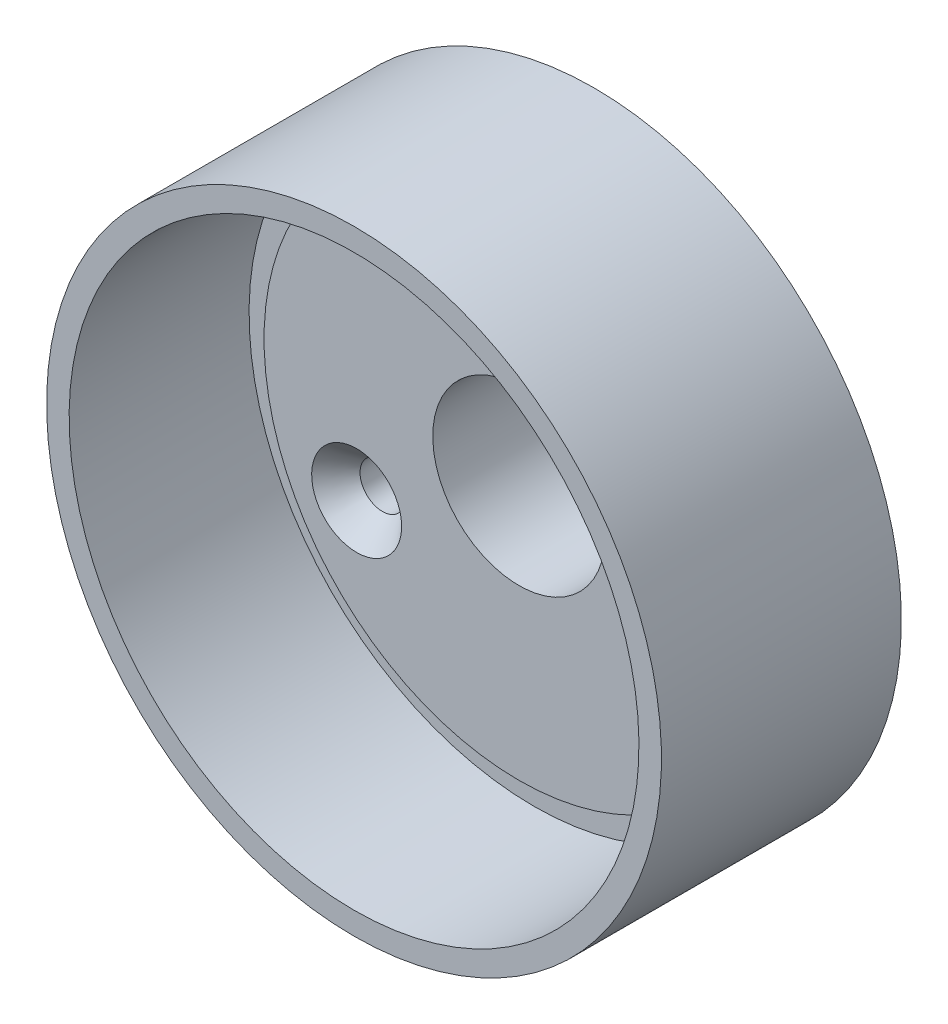
ISO-10303-21;
HEADER;
FILE_DESCRIPTION(('STEP AP214'),'2;1');
FILE_NAME('part.step','',(''),(''),'','','');
FILE_SCHEMA(('AUTOMOTIVE_DESIGN { 1 0 10303 214 1 1 1 1 }'));
ENDSEC;
DATA;
#1=APPLICATION_CONTEXT('core data for automotive mechanical design processes');
#2=APPLICATION_PROTOCOL_DEFINITION('international standard','automotive_design',2000,#1);
#3=PRODUCT_CONTEXT('',#1,'mechanical');
#4=PRODUCT('Part','Part','',(#3));
#5=PRODUCT_RELATED_PRODUCT_CATEGORY('part','',(#4));
#6=PRODUCT_DEFINITION_FORMATION('','',#4);
#7=PRODUCT_DEFINITION_CONTEXT('part definition',#1,'design');
#8=PRODUCT_DEFINITION('design','',#6,#7);
#9=PRODUCT_DEFINITION_SHAPE('','',#8);
#10=(LENGTH_UNIT() NAMED_UNIT(*) SI_UNIT(.MILLI.,.METRE.));
#11=(NAMED_UNIT(*) PLANE_ANGLE_UNIT() SI_UNIT($,.RADIAN.));
#12=(NAMED_UNIT(*) SI_UNIT($,.STERADIAN.) SOLID_ANGLE_UNIT());
#13=UNCERTAINTY_MEASURE_WITH_UNIT(LENGTH_MEASURE(1.E-05),#10,'distance_accuracy_value','');
#14=(GEOMETRIC_REPRESENTATION_CONTEXT(3) GLOBAL_UNCERTAINTY_ASSIGNED_CONTEXT((#13)) GLOBAL_UNIT_ASSIGNED_CONTEXT((#10,
#11,#12)) REPRESENTATION_CONTEXT('',''));
#15=CARTESIAN_POINT('',(0.,0.,0.));
#16=DIRECTION('',(0.,0.,1.));
#17=DIRECTION('',(1.,0.,0.));
#18=AXIS2_PLACEMENT_3D('',#15,#16,#17);
#19=CARTESIAN_POINT('',(0.,53.975,41.275));
#20=DIRECTION('',(0.,0.,-1.));
#21=DIRECTION('',(0.,1.,0.));
#22=AXIS2_PLACEMENT_3D('',#19,#20,#21);
#23=PLANE('',#22);
#24=CARTESIAN_POINT('',(0.,39.6875,41.275));
#25=DIRECTION('',(0.,0.,1.));
#26=DIRECTION('',(1.,0.,0.));
#27=AXIS2_PLACEMENT_3D('',#24,#25,#26);
#28=CIRCLE('',#27,9.525);
#29=CARTESIAN_POINT('',(9.525,39.6875,41.275));
#30=VERTEX_POINT('',#29);
#31=EDGE_CURVE('E80',#30,#30,#28,.T.);
#32=ORIENTED_EDGE('',*,*,#31,.F.);
#33=EDGE_LOOP('',(#32));
#34=FACE_BOUND('',#33,.T.);
#35=CARTESIAN_POINT('',(0.,0.,41.275));
#36=DIRECTION('',(0.,0.,-1.));
#37=DIRECTION('',(0.,1.,0.));
#38=AXIS2_PLACEMENT_3D('',#35,#36,#37);
#39=CIRCLE('',#38,18.25625);
#40=CARTESIAN_POINT('',(0.,18.25625,41.275));
#41=VERTEX_POINT('',#40);
#42=EDGE_CURVE('E88',#41,#41,#39,.T.);
#43=ORIENTED_EDGE('',*,*,#42,.T.);
#44=EDGE_LOOP('',(#43));
#45=FACE_BOUND('',#44,.T.);
#46=CARTESIAN_POINT('',(0.,0.,41.275));
#47=DIRECTION('',(0.,0.,1.));
#48=DIRECTION('',(0.,-1.,0.));
#49=AXIS2_PLACEMENT_3D('',#46,#47,#48);
#50=CIRCLE('',#49,53.975);
#51=CARTESIAN_POINT('',(0.,-53.975,41.275));
#52=VERTEX_POINT('',#51);
#53=EDGE_CURVE('E92',#52,#52,#50,.T.);
#54=ORIENTED_EDGE('',*,*,#53,.T.);
#55=EDGE_LOOP('',(#54));
#56=FACE_BOUND('',#55,.T.);
#57=CARTESIAN_POINT('',(34.3703832126948,-19.8437500000002,41.275));
#58=DIRECTION('',(0.,0.,1.));
#59=DIRECTION('',(0.,-1.,0.));
#60=AXIS2_PLACEMENT_3D('',#57,#58,#59);
#61=CIRCLE('',#60,9.525);
#62=CARTESIAN_POINT('',(34.3703832126948,-29.3687500000002,41.275));
#63=VERTEX_POINT('',#62);
#64=EDGE_CURVE('E74',#63,#63,#61,.T.);
#65=ORIENTED_EDGE('',*,*,#64,.F.);
#66=EDGE_LOOP('',(#65));
#67=FACE_BOUND('',#66,.T.);
#68=CARTESIAN_POINT('',(-34.3703832126951,-19.8437499999997,41.275));
#69=DIRECTION('',(0.,0.,1.));
#70=DIRECTION('',(0.,-1.,0.));
#71=AXIS2_PLACEMENT_3D('',#68,#69,#70);
#72=CIRCLE('',#71,9.525);
#73=CARTESIAN_POINT('',(-34.3703832126951,-29.3687499999997,41.275));
#74=VERTEX_POINT('',#73);
#75=EDGE_CURVE('E137',#74,#74,#72,.T.);
#76=ORIENTED_EDGE('',*,*,#75,.F.);
#77=EDGE_LOOP('',(#76));
#78=FACE_BOUND('',#77,.T.);
#79=ADVANCED_FACE('F45',(#34,#45,#56,#67,#78),#23,.F.);
#80=CARTESIAN_POINT('',(0.,0.,0.));
#81=DIRECTION('',(0.,0.,1.));
#82=DIRECTION('',(0.,-1.,0.));
#83=AXIS2_PLACEMENT_3D('',#80,#81,#82);
#84=PLANE('',#83);
#85=CARTESIAN_POINT('',(0.,0.,0.));
#86=DIRECTION('',(0.,0.,1.));
#87=DIRECTION('',(0.,-1.,0.));
#88=AXIS2_PLACEMENT_3D('',#85,#86,#87);
#89=CIRCLE('',#88,24.60625);
#90=CARTESIAN_POINT('',(0.,-24.60625,0.));
#91=VERTEX_POINT('',#90);
#92=EDGE_CURVE('E10',#91,#91,#89,.F.);
#93=ORIENTED_EDGE('',*,*,#92,.T.);
#94=EDGE_LOOP('',(#93));
#95=FACE_BOUND('',#94,.T.);
#96=CARTESIAN_POINT('',(0.,0.,0.));
#97=DIRECTION('',(0.,0.,-1.));
#98=DIRECTION('',(0.,1.,0.));
#99=AXIS2_PLACEMENT_3D('',#96,#97,#98);
#100=CIRCLE('',#99,18.25625);
#101=CARTESIAN_POINT('',(0.,18.25625,0.));
#102=VERTEX_POINT('',#101);
#103=EDGE_CURVE('E86',#102,#102,#100,.T.);
#104=ORIENTED_EDGE('',*,*,#103,.F.);
#105=EDGE_LOOP('',(#104));
#106=FACE_BOUND('',#105,.T.);
#107=ADVANCED_FACE('F188',(#95,#106),#84,.F.);
#108=CARTESIAN_POINT('',(0.,0.,41.275));
#109=DIRECTION('',(0.,0.,1.));
#110=DIRECTION('',(0.,-1.,0.));
#111=AXIS2_PLACEMENT_3D('',#108,#109,#110);
#112=CYLINDRICAL_SURFACE('',#111,26.19375);
#113=CARTESIAN_POINT('',(0.,26.19375,7.34187000000001));
#114=CARTESIAN_POINT('',(0.148871746551131,26.1937515911501,7.34186692463104));
#115=CARTESIAN_POINT('',(0.297705413502392,26.1924786625638,7.34807598780385));
#116=CARTESIAN_POINT('',(0.594341524705745,26.1874259622232,7.37285660704999));
#117=CARTESIAN_POINT('',(0.742143795458679,26.1836457785093,7.39143019470353));
#118=CARTESIAN_POINT('',(1.03567818011506,26.1736794521536,7.44080857493469));
#119=CARTESIAN_POINT('',(1.18140922183911,26.1674921073144,7.47161947929959));
#120=CARTESIAN_POINT('',(1.46975064124925,26.152881626372,7.54524131476199));
#121=CARTESIAN_POINT('',(1.61235985088439,26.1444576683969,7.58805665736694));
#122=CARTESIAN_POINT('',(1.8932116565107,26.1256210065463,7.6852856100695));
#123=CARTESIAN_POINT('',(2.03145994310377,26.1152110309246,7.73968332087084));
#124=CARTESIAN_POINT('',(2.30289834536971,26.092676251379,7.85972656333015));
#125=CARTESIAN_POINT('',(2.43608657342718,26.0805508153313,7.92537624307971));
#126=CARTESIAN_POINT('',(2.69639867246803,26.0549241652897,8.06740187199192));
#127=CARTESIAN_POINT('',(2.82352518300784,26.0414235582919,8.14377309428154));
#128=CARTESIAN_POINT('',(3.0709822836121,26.0134027115261,8.30675708248218));
#129=CARTESIAN_POINT('',(3.19131031024998,25.9988820917222,8.39337367391583));
#130=CARTESIAN_POINT('',(3.42576584752109,25.9690355259618,8.57735976120501));
#131=CARTESIAN_POINT('',(3.5397988764664,25.9537018707843,8.67484842383293));
#132=CARTESIAN_POINT('',(3.75931769734918,25.9228154901271,8.87906174537798));
#133=CARTESIAN_POINT('',(3.8648003059764,25.907262685565,8.98578981381085));
#134=CARTESIAN_POINT('',(4.06643169591759,25.8763806318585,9.20770012085483));
#135=CARTESIAN_POINT('',(4.16258313638527,25.8610513200888,9.32287993439777));
#136=CARTESIAN_POINT('',(4.34496151168322,25.8310355048376,9.56099296032799));
#137=CARTESIAN_POINT('',(4.4311847728031,25.81634924054,9.68392901686704));
#138=CARTESIAN_POINT('',(4.5938070534725,25.7879110431686,9.93785734954699));
#139=CARTESIAN_POINT('',(4.67010830014678,25.7741689586909,10.0689133842631));
#140=CARTESIAN_POINT('',(4.81140916465722,25.7481658371809,10.3371848387217));
#141=CARTESIAN_POINT('',(4.87640453977239,25.7359053566704,10.4744025465384));
#142=CARTESIAN_POINT('',(4.99453740007469,25.7132410074832,10.7539390751673));
#143=CARTESIAN_POINT('',(5.04768023488058,25.702836301633,10.8962555608556));
#144=CARTESIAN_POINT('',(5.14174213064812,25.6841837334584,11.1850247651049));
#145=CARTESIAN_POINT('',(5.18265676144819,25.6759366529556,11.3314789617376));
#146=CARTESIAN_POINT('',(5.28551388695972,25.6550383462677,11.7713028032196));
#147=CARTESIAN_POINT('',(5.32933084749174,25.6458799410415,12.0693205613473));
#148=CARTESIAN_POINT('',(5.36644733775803,25.6381378936375,12.6684427936592));
#149=CARTESIAN_POINT('',(5.35975227669572,25.6395531191564,12.9695469338822));
#150=CARTESIAN_POINT('',(5.29665731533733,25.6526596642628,13.5614644352028));
#151=CARTESIAN_POINT('',(5.24104499582967,25.664188149798,13.8523652318396));
#152=CARTESIAN_POINT('',(5.08292017683002,25.6959705290794,14.4206073584789));
#153=CARTESIAN_POINT('',(4.98040534462067,25.7162248568063,14.6979480133022));
#154=CARTESIAN_POINT('',(4.73064494660481,25.763340585481,15.2334684278735));
#155=CARTESIAN_POINT('',(4.58308933695165,25.790247528558,15.4914994320871));
#156=CARTESIAN_POINT('',(4.24765323436708,25.8476081774373,15.979432459517));
#157=CARTESIAN_POINT('',(4.05976790261828,25.8780623086355,16.2093311021711));
#158=CARTESIAN_POINT('',(3.64479926898732,25.9397899480534,16.6390179548893));
#159=CARTESIAN_POINT('',(3.41704415335653,25.9710680836429,16.838157267122));
#160=CARTESIAN_POINT('',(2.93102768103793,26.0303947828745,17.1955101096652));
#161=CARTESIAN_POINT('',(2.6727658978226,26.0584433013512,17.3537230676671));
#162=CARTESIAN_POINT('',(2.13232967161344,26.108224339167,17.6248616483578));
#163=CARTESIAN_POINT('',(1.85011568378543,26.1299461405107,17.7377105419837));
#164=CARTESIAN_POINT('',(1.27019074048084,26.1645453868809,17.9142120198188));
#165=CARTESIAN_POINT('',(0.972481755592514,26.1774239536104,17.9778708435752));
#166=CARTESIAN_POINT('',(0.375591526619147,26.1927286372221,18.0532605470115));
#167=CARTESIAN_POINT('',(0.0765268373637532,26.1953334054541,18.0658790678415));
#168=CARTESIAN_POINT('',(-0.519437454369359,26.1902942650871,18.0412241152827));
#169=CARTESIAN_POINT('',(-0.816337183395867,26.1826509604277,18.0039535819571));
#170=CARTESIAN_POINT('',(-1.396661817724,26.158086500642,17.8813156749837));
#171=CARTESIAN_POINT('',(-1.68018754537979,26.1412537027599,17.7964061396032));
#172=CARTESIAN_POINT('',(-2.22897624889313,26.1001914792558,17.5814025787461));
#173=CARTESIAN_POINT('',(-2.49423780827522,26.0759614807349,17.4513050534391));
#174=CARTESIAN_POINT('',(-3.00269476021075,26.0223484821421,17.1477152661952));
#175=CARTESIAN_POINT('',(-3.24556624348463,25.9929038076644,16.9736916433325));
#176=CARTESIAN_POINT('',(-3.69897815538946,25.9322679242414,16.587897140932));
#177=CARTESIAN_POINT('',(-3.90951494123167,25.901076519051,16.3761220141529));
#178=CARTESIAN_POINT('',(-4.29572708822623,25.8398567155284,15.9167913016102));
#179=CARTESIAN_POINT('',(-4.47079178395718,25.8098548575974,15.668718150688));
#180=CARTESIAN_POINT('',(-4.77676940476818,25.75498557055,15.1461540039687));
#181=CARTESIAN_POINT('',(-4.90768413697859,25.7301179312978,14.8716640900444));
#182=CARTESIAN_POINT('',(-5.12082881776931,25.6885468108221,14.3055251349438));
#183=CARTESIAN_POINT('',(-5.20331701776745,25.6718001067432,14.0139764043954));
#184=CARTESIAN_POINT('',(-5.31802799160091,25.6482881181014,13.4206065079688));
#185=CARTESIAN_POINT('',(-5.35025766317422,25.6415214638324,13.118786757549));
#186=CARTESIAN_POINT('',(-5.36010006221986,25.6394565515686,12.6683834566376));
#187=CARTESIAN_POINT('',(-5.35716199847905,25.6400741426857,12.5199933570552));
#188=CARTESIAN_POINT('',(-5.33900101169208,25.6438634312188,12.224014813907));
#189=CARTESIAN_POINT('',(-5.32378275831803,25.6470341577772,12.0764260870833));
#190=CARTESIAN_POINT('',(-5.28116974710185,25.6558423561152,11.7830510285106));
#191=CARTESIAN_POINT('',(-5.25377074168674,25.6614806883677,11.6372653437468));
#192=CARTESIAN_POINT('',(-5.18702733784682,25.6750549535597,11.3486170419729));
#193=CARTESIAN_POINT('',(-5.14768719593117,25.6829900677472,11.2057534027148));
#194=CARTESIAN_POINT('',(-5.05746609396308,25.7009082137717,10.9242198654281));
#195=CARTESIAN_POINT('',(-5.00661213439714,25.7108864492324,10.7855410026397));
#196=CARTESIAN_POINT('',(-4.89371223547069,25.7326139529122,10.5130195230195));
#197=CARTESIAN_POINT('',(-4.83167024899095,25.7443625953824,10.3791752180567));
#198=CARTESIAN_POINT('',(-4.69680155756938,25.7693091955288,10.1171064556716));
#199=CARTESIAN_POINT('',(-4.62397034271969,25.7825077586741,9.98888437753305));
#200=CARTESIAN_POINT('',(-4.46807881710782,25.8099800503979,9.7390022187212));
#201=CARTESIAN_POINT('',(-4.38502200398642,25.8242534106994,9.61733991465508));
#202=CARTESIAN_POINT('',(-4.20762720520825,25.8537548551139,9.379175483211));
#203=CARTESIAN_POINT('',(-4.11311202676453,25.8689955549439,9.26280686009886));
#204=CARTESIAN_POINT('',(-3.91472408005655,25.8997595362937,9.03845551747952));
#205=CARTESIAN_POINT('',(-3.81085460203404,25.9152827169338,8.93046987407062));
#206=CARTESIAN_POINT('',(-3.59436462548194,25.9461951297747,8.72350168630908));
#207=CARTESIAN_POINT('',(-3.48173898564308,25.9615842772887,8.62452450657526));
#208=CARTESIAN_POINT('',(-3.24858762523267,25.991787701491,8.43635491021379));
#209=CARTESIAN_POINT('',(-3.12806482525188,26.0066021875142,8.34715890849798));
#210=CARTESIAN_POINT('',(-2.87846579263942,26.0354168752471,8.17816807026167));
#211=CARTESIAN_POINT('',(-2.74930745246039,26.0494058168422,8.09849251477932));
#212=CARTESIAN_POINT('',(-2.48463814679875,26.0759811814071,7.95035558539762));
#213=CARTESIAN_POINT('',(-2.3491295453534,26.088568120505,7.88189008027917));
#214=CARTESIAN_POINT('',(-2.07274006638514,26.1119800138243,7.7566910914999));
#215=CARTESIAN_POINT('',(-1.93186242218453,26.1228060084485,7.69995067501336));
#216=CARTESIAN_POINT('',(-1.64571744093379,26.1423934895487,7.59860632378937));
#217=CARTESIAN_POINT('',(-1.50045094066862,26.1511553668041,7.55400009155558));
#218=CARTESIAN_POINT('',(-1.13303665915156,26.1701617927147,7.45808871577462));
#219=CARTESIAN_POINT('',(-0.908731910936369,26.1789607168127,7.41456740056444));
#220=CARTESIAN_POINT('',(-0.456254891661257,26.190753501247,7.35646089862102));
#221=CARTESIAN_POINT('',(-0.228082754558985,26.1937475622379,7.34187471169743));
#222=CARTESIAN_POINT('',(0.,26.19375,7.34187000000001));
#223=B_SPLINE_CURVE_WITH_KNOTS('',3,(#113,#114,#115,#116,#117,#118,#119,#120,#121,#122,#123,
#124,#125,#126,#127,#128,#129,#130,#131,#132,#133,#134,#135,#136,#137,#138,#139,#140,#141,#142,
#143,#144,#145,#146,#147,#148,#149,#150,#151,#152,#153,#154,#155,#156,#157,#158,#159,#160,#161,
#162,#163,#164,#165,#166,#167,#168,#169,#170,#171,#172,#173,#174,#175,#176,#177,#178,#179,#180,
#181,#182,#183,#184,#185,#186,#187,#188,#189,#190,#191,#192,#193,#194,#195,#196,#197,#198,#199,
#200,#201,#202,#203,#204,#205,#206,#207,#208,#209,#210,#211,#212,#213,#214,#215,#216,#217,#218,
#219,#220,#221,#222),.UNSPECIFIED.,.T.,.F.,(4,2,2,2,2,2,2,2,2,2,2,2,2,2,2,2,2,2,2,2,2,2,2,2,2,2,
2,2,2,2,2,2,2,2,2,2,2,2,2,2,2,2,2,2,2,2,2,2,2,2,2,2,2,2,4),(0.,0.446414906953677,
0.892903181193806,1.33961472984994,1.78649065605355,2.23275705868963,2.67918833481071,
3.12542340452248,3.57182562325306,4.02371912110881,4.47578009291526,4.92771185780607,
5.37981031660043,5.836071722742,6.29250398109568,6.74872981093765,7.20512072723979,
8.10441403380109,9.00361103870535,9.88859040936994,10.7736137996632,11.6648722583998,
12.5562377114251,13.4643968521202,14.3725686917022,15.2822702201139,16.1918563378801,
17.0855540230219,17.9791990430621,18.8643992133508,19.7496679580881,20.6462068058267,
21.542846582598,22.4538107197215,23.364737565063,24.2707613786306,25.1766608338996,
25.6214873839223,26.0661448636051,26.5109575224076,26.9556118101774,27.3992339673262,
27.8426996927853,28.2863513131448,28.7298516029741,29.1813907107022,29.6327716116954,
30.0844195788673,30.5359014465832,30.992550567454,31.4490310196327,31.9052407862365,
32.3613641134931,33.0453290951381,33.7292704339953),.UNSPECIFIED.);
#224=CARTESIAN_POINT('',(0.,26.19375,7.34187000000001));
#225=VERTEX_POINT('',#224);
#226=EDGE_CURVE('E141',#225,#225,#223,.T.);
#227=ORIENTED_EDGE('',*,*,#226,.T.);
#228=EDGE_LOOP('',(#227));
#229=FACE_BOUND('',#228,.T.);
#230=CARTESIAN_POINT('',(0.,0.,1.58750000000003));
#231=DIRECTION('',(0.,0.,1.));
#232=DIRECTION('',(0.,-1.,0.));
#233=AXIS2_PLACEMENT_3D('',#230,#231,#232);
#234=CIRCLE('',#233,26.19375);
#235=CARTESIAN_POINT('',(0.,-26.19375,1.58750000000003));
#236=VERTEX_POINT('',#235);
#237=EDGE_CURVE('E60',#236,#236,#234,.T.);
#238=ORIENTED_EDGE('',*,*,#237,.T.);
#239=EDGE_LOOP('',(#238));
#240=FACE_BOUND('',#239,.T.);
#241=CARTESIAN_POINT('',(0.,0.,25.4));
#242=DIRECTION('',(0.,0.,1.));
#243=DIRECTION('',(0.,-1.,0.));
#244=AXIS2_PLACEMENT_3D('',#241,#242,#243);
#245=CIRCLE('',#244,26.19375);
#246=CARTESIAN_POINT('',(0.,-26.19375,25.4));
#247=VERTEX_POINT('',#246);
#248=EDGE_CURVE('E67',#247,#247,#245,.T.);
#249=ORIENTED_EDGE('',*,*,#248,.F.);
#250=EDGE_LOOP('',(#249));
#251=FACE_BOUND('',#250,.T.);
#252=ADVANCED_FACE('F148',(#229,#240,#251),#112,.T.);
#253=CARTESIAN_POINT('',(0.,26.19375,25.4));
#254=DIRECTION('',(0.,0.,1.));
#255=DIRECTION('',(0.,-1.,0.));
#256=AXIS2_PLACEMENT_3D('',#253,#254,#255);
#257=PLANE('',#256);
#258=CARTESIAN_POINT('',(-34.3703832126951,-19.8437499999997,25.4));
#259=DIRECTION('',(0.,0.,1.));
#260=DIRECTION('',(0.,-1.,0.));
#261=AXIS2_PLACEMENT_3D('',#258,#259,#260);
#262=CIRCLE('',#261,4.76249999999999);
#263=CARTESIAN_POINT('',(-34.3703832126951,-24.6062499999997,25.4));
#264=VERTEX_POINT('',#263);
#265=EDGE_CURVE('E70',#264,#264,#262,.T.);
#266=ORIENTED_EDGE('',*,*,#265,.T.);
#267=EDGE_LOOP('',(#266));
#268=FACE_BOUND('',#267,.T.);
#269=CARTESIAN_POINT('',(34.3703832126948,-19.8437500000002,25.4));
#270=DIRECTION('',(0.,0.,1.));
#271=DIRECTION('',(0.,-1.,0.));
#272=AXIS2_PLACEMENT_3D('',#269,#270,#271);
#273=CIRCLE('',#272,4.76249999999999);
#274=CARTESIAN_POINT('',(34.3703832126948,-24.6062500000002,25.4));
#275=VERTEX_POINT('',#274);
#276=EDGE_CURVE('E76',#275,#275,#273,.T.);
#277=ORIENTED_EDGE('',*,*,#276,.T.);
#278=EDGE_LOOP('',(#277));
#279=FACE_BOUND('',#278,.T.);
#280=CARTESIAN_POINT('',(0.,39.6875,25.4));
#281=DIRECTION('',(0.,0.,1.));
#282=DIRECTION('',(0.,-1.,0.));
#283=AXIS2_PLACEMENT_3D('',#280,#281,#282);
#284=CIRCLE('',#283,4.76249999999999);
#285=CARTESIAN_POINT('',(0.,34.925,25.4));
#286=VERTEX_POINT('',#285);
#287=EDGE_CURVE('E82',#286,#286,#284,.T.);
#288=ORIENTED_EDGE('',*,*,#287,.T.);
#289=EDGE_LOOP('',(#288));
#290=FACE_BOUND('',#289,.T.);
#291=CARTESIAN_POINT('',(0.,0.,25.4));
#292=DIRECTION('',(0.,0.,1.));
#293=DIRECTION('',(0.,-1.,0.));
#294=AXIS2_PLACEMENT_3D('',#291,#292,#293);
#295=CIRCLE('',#294,65.0875);
#296=CARTESIAN_POINT('',(0.,-65.0875,25.4));
#297=VERTEX_POINT('',#296);
#298=EDGE_CURVE('E96',#297,#297,#295,.T.);
#299=ORIENTED_EDGE('',*,*,#298,.F.);
#300=EDGE_LOOP('',(#299));
#301=FACE_BOUND('',#300,.T.);
#302=ORIENTED_EDGE('',*,*,#248,.T.);
#303=EDGE_LOOP('',(#302));
#304=FACE_BOUND('',#303,.T.);
#305=ADVANCED_FACE('F207',(#268,#279,#290,#301,#304),#257,.F.);
#306=CARTESIAN_POINT('',(0.,0.,41.275));
#307=DIRECTION('',(0.,0.,1.));
#308=DIRECTION('',(0.,-1.,0.));
#309=AXIS2_PLACEMENT_3D('',#306,#307,#308);
#310=CYLINDRICAL_SURFACE('',#309,65.0875);
#311=CARTESIAN_POINT('',(0.,0.,76.2));
#312=DIRECTION('',(0.,0.,1.));
#313=DIRECTION('',(0.,-1.,0.));
#314=AXIS2_PLACEMENT_3D('',#311,#312,#313);
#315=CIRCLE('',#314,65.0875);
#316=CARTESIAN_POINT('',(0.,-65.0875,76.2));
#317=VERTEX_POINT('',#316);
#318=EDGE_CURVE('E100',#317,#317,#315,.T.);
#319=ORIENTED_EDGE('',*,*,#318,.F.);
#320=EDGE_LOOP('',(#319));
#321=FACE_BOUND('',#320,.T.);
#322=ORIENTED_EDGE('',*,*,#298,.T.);
#323=EDGE_LOOP('',(#322));
#324=FACE_BOUND('',#323,.T.);
#325=ADVANCED_FACE('F204',(#321,#324),#310,.T.);
#326=CARTESIAN_POINT('',(0.,65.0875,76.2));
#327=DIRECTION('',(0.,0.,-1.));
#328=DIRECTION('',(0.,1.,0.));
#329=AXIS2_PLACEMENT_3D('',#326,#327,#328);
#330=PLANE('',#329);
#331=CARTESIAN_POINT('',(0.,0.,76.2));
#332=DIRECTION('',(0.,0.,1.));
#333=DIRECTION('',(0.,-1.,0.));
#334=AXIS2_PLACEMENT_3D('',#331,#332,#333);
#335=CIRCLE('',#334,60.325);
#336=CARTESIAN_POINT('',(0.,-60.325,76.2));
#337=VERTEX_POINT('',#336);
#338=EDGE_CURVE('E104',#337,#337,#335,.T.);
#339=ORIENTED_EDGE('',*,*,#338,.F.);
#340=EDGE_LOOP('',(#339));
#341=FACE_BOUND('',#340,.T.);
#342=ORIENTED_EDGE('',*,*,#318,.T.);
#343=EDGE_LOOP('',(#342));
#344=FACE_BOUND('',#343,.T.);
#345=ADVANCED_FACE('F200',(#341,#344),#330,.F.);
#346=CARTESIAN_POINT('',(0.,0.,41.275));
#347=DIRECTION('',(0.,0.,1.));
#348=DIRECTION('',(0.,-1.,0.));
#349=AXIS2_PLACEMENT_3D('',#346,#347,#348);
#350=CYLINDRICAL_SURFACE('',#349,60.325);
#351=CARTESIAN_POINT('',(0.,0.,38.1));
#352=DIRECTION('',(0.,0.,1.));
#353=DIRECTION('',(0.,-1.,0.));
#354=AXIS2_PLACEMENT_3D('',#351,#352,#353);
#355=CIRCLE('',#354,60.325);
#356=CARTESIAN_POINT('',(0.,-60.325,38.1));
#357=VERTEX_POINT('',#356);
#358=EDGE_CURVE('E108',#357,#357,#355,.T.);
#359=ORIENTED_EDGE('',*,*,#358,.F.);
#360=EDGE_LOOP('',(#359));
#361=FACE_BOUND('',#360,.T.);
#362=ORIENTED_EDGE('',*,*,#338,.T.);
#363=EDGE_LOOP('',(#362));
#364=FACE_BOUND('',#363,.T.);
#365=ADVANCED_FACE('F196',(#361,#364),#350,.F.);
#366=CARTESIAN_POINT('',(0.,60.325,38.1));
#367=DIRECTION('',(0.,0.,-1.));
#368=DIRECTION('',(0.,1.,0.));
#369=AXIS2_PLACEMENT_3D('',#366,#367,#368);
#370=PLANE('',#369);
#371=CARTESIAN_POINT('',(0.,0.,38.1));
#372=DIRECTION('',(0.,0.,1.));
#373=DIRECTION('',(0.,-1.,0.));
#374=AXIS2_PLACEMENT_3D('',#371,#372,#373);
#375=CIRCLE('',#374,53.975);
#376=CARTESIAN_POINT('',(0.,-53.975,38.1));
#377=VERTEX_POINT('',#376);
#378=EDGE_CURVE('E112',#377,#377,#375,.T.);
#379=ORIENTED_EDGE('',*,*,#378,.F.);
#380=EDGE_LOOP('',(#379));
#381=FACE_BOUND('',#380,.T.);
#382=ORIENTED_EDGE('',*,*,#358,.T.);
#383=EDGE_LOOP('',(#382));
#384=FACE_BOUND('',#383,.T.);
#385=ADVANCED_FACE('F192',(#381,#384),#370,.F.);
#386=CARTESIAN_POINT('',(0.,0.,41.275));
#387=DIRECTION('',(0.,0.,1.));
#388=DIRECTION('',(0.,-1.,0.));
#389=AXIS2_PLACEMENT_3D('',#386,#387,#388);
#390=CYLINDRICAL_SURFACE('',#389,53.975);
#391=ORIENTED_EDGE('',*,*,#53,.F.);
#392=EDGE_LOOP('',(#391));
#393=FACE_BOUND('',#392,.T.);
#394=ORIENTED_EDGE('',*,*,#378,.T.);
#395=EDGE_LOOP('',(#394));
#396=FACE_BOUND('',#395,.T.);
#397=ADVANCED_FACE('F184',(#393,#396),#390,.T.);
#398=CARTESIAN_POINT('',(0.,0.,76.2));
#399=DIRECTION('',(0.,0.,-1.));
#400=DIRECTION('',(0.,1.,0.));
#401=AXIS2_PLACEMENT_3D('',#398,#399,#400);
#402=CYLINDRICAL_SURFACE('',#401,18.25625);
#403=CARTESIAN_POINT('',(0.,18.25625,18.05813));
#404=CARTESIAN_POINT('',(0.294234229185236,18.2562469989064,18.0581256619867));
#405=CARTESIAN_POINT('',(0.588512539338757,18.2490683666006,18.0338132436042));
#406=CARTESIAN_POINT('',(1.16851809271139,18.2211317931256,17.9374247058465));
#407=CARTESIAN_POINT('',(1.45424243733006,18.2003693021919,17.8653325830786));
#408=CARTESIAN_POINT('',(2.00868937506821,18.1475434232208,17.6759854666374));
#409=CARTESIAN_POINT('',(2.27743577543082,18.1154962933917,17.5587954248119));
#410=CARTESIAN_POINT('',(2.79146383301142,18.0434433071779,17.282840299836));
#411=CARTESIAN_POINT('',(3.03674266662531,18.0034364948677,17.124070222367));
#412=CARTESIAN_POINT('',(3.50364249378141,17.9185074274433,16.764842692353));
#413=CARTESIAN_POINT('',(3.72452414255791,17.8734877301321,16.5634473693748));
#414=CARTESIAN_POINT('',(4.12991282411032,17.784196942637,16.1266862597508));
#415=CARTESIAN_POINT('',(4.31441404946884,17.739925973002,15.8913150598961));
#416=CARTESIAN_POINT('',(4.64563625258481,17.6561214302253,15.3871002275837));
#417=CARTESIAN_POINT('',(4.7914654336255,17.6167093382364,15.1176486879207));
#418=CARTESIAN_POINT('',(5.03544340435411,17.5485365571795,14.5567040234941));
#419=CARTESIAN_POINT('',(5.13360309083567,17.5197734342159,14.2652159536951));
#420=CARTESIAN_POINT('',(5.2768095772386,17.4771687958381,13.6767527856616));
#421=CARTESIAN_POINT('',(5.32321498831004,17.4629464497465,13.3801366123053));
#422=CARTESIAN_POINT('',(5.36583684664688,17.4498997117906,12.7830142752434));
#423=CARTESIAN_POINT('',(5.36206487059685,17.4510717682032,12.4825090247902));
#424=CARTESIAN_POINT('',(5.30550846938312,17.4683431983994,11.897093886885));
#425=CARTESIAN_POINT('',(5.25441392777852,17.4839278707841,11.612003062176));
#426=CARTESIAN_POINT('',(5.10738823628833,17.5274376003264,11.0546319230278));
#427=CARTESIAN_POINT('',(5.01145283280131,17.5553638281895,10.7823528266059));
#428=CARTESIAN_POINT('',(4.77619753669239,17.6208292133593,10.2541458763201));
#429=CARTESIAN_POINT('',(4.63632065746822,17.6584906186241,9.9984818928225));
#430=CARTESIAN_POINT('',(4.31754035830356,17.7391227069298,9.51368307917752));
#431=CARTESIAN_POINT('',(4.13862783210328,17.7820946277953,9.28455445834));
#432=CARTESIAN_POINT('',(3.73841157783092,17.8706046166327,8.84973082501084));
#433=CARTESIAN_POINT('',(3.51570193055834,17.9161766823559,8.64533461060446));
#434=CARTESIAN_POINT('',(3.03860033776285,18.0032300224246,8.27649635573825));
#435=CARTESIAN_POINT('',(2.78420656621836,18.0447110607487,8.11205661966605));
#436=CARTESIAN_POINT('',(2.24866907270914,18.1192602449331,7.82705577532862));
#437=CARTESIAN_POINT('',(1.96736985191207,18.1522748526485,7.70677192294343));
#438=CARTESIAN_POINT('',(1.38734291674592,18.2057855821766,7.51559914596907));
#439=CARTESIAN_POINT('',(1.08861987020909,18.2262850400684,7.44469705730595));
#440=CARTESIAN_POINT('',(0.493274919838409,18.2519327485917,7.35643754997585));
#441=CARTESIAN_POINT('',(0.196935481870789,18.257585764534,7.33731880882334));
#442=CARTESIAN_POINT('',(-0.394731482444612,18.2543784800857,7.34824676206842));
#443=CARTESIAN_POINT('',(-0.690059132748524,18.2455200262507,7.37828720105802));
#444=CARTESIAN_POINT('',(-1.26474502991353,18.2146148054537,7.48525192980087));
#445=CARTESIAN_POINT('',(-1.54430995228897,18.1928550562576,7.56115655233828));
#446=CARTESIAN_POINT('',(-2.08668354505418,18.1386538925805,7.75647692899189));
#447=CARTESIAN_POINT('',(-2.34949023004834,18.1062112152589,7.8758978273922));
#448=CARTESIAN_POINT('',(-2.85744236326553,18.0331100902955,8.15787969982653));
#449=CARTESIAN_POINT('',(-3.10205841220582,17.9922834467443,8.32134955614545));
#450=CARTESIAN_POINT('',(-3.56099104631718,17.9071096987622,8.68567717331906));
#451=CARTESIAN_POINT('',(-3.77530033628239,17.8627617507083,8.88654390919448));
#452=CARTESIAN_POINT('',(-4.17522592396568,17.7736219302707,9.32823083848));
#453=CARTESIAN_POINT('',(-4.35959070177976,17.7288679212446,9.57019425596457));
#454=CARTESIAN_POINT('',(-4.68517532207026,17.6456266170813,10.0825945975287));
#455=CARTESIAN_POINT('',(-4.82639648147544,17.6071391306797,10.3530306521621));
#456=CARTESIAN_POINT('',(-5.06068581320763,17.541235786978,10.9137097679694));
#457=CARTESIAN_POINT('',(-5.15399388130286,17.5137649252491,11.2038457503423));
#458=CARTESIAN_POINT('',(-5.29017489524858,17.4731182562003,11.7966611789527));
#459=CARTESIAN_POINT('',(-5.33306419070013,17.4599378149468,12.099336525996));
#460=CARTESIAN_POINT('',(-5.36611173834962,17.449807147555,12.6956775252485));
#461=CARTESIAN_POINT('',(-5.35830391932573,17.4522308608965,12.9892213421333));
#462=CARTESIAN_POINT('',(-5.29500602388491,17.4715381726093,13.570612974437));
#463=CARTESIAN_POINT('',(-5.23951770676706,17.4884212374641,13.8584609996163));
#464=CARTESIAN_POINT('',(-5.08372121222863,17.5343341844352,14.4171218551884));
#465=CARTESIAN_POINT('',(-4.98392966140078,17.5632238150505,14.688091129822));
#466=CARTESIAN_POINT('',(-4.74276011621499,17.6298744040502,15.2096565700323));
#467=CARTESIAN_POINT('',(-4.60137443180245,17.6676370026368,15.4602489573208));
#468=CARTESIAN_POINT('',(-4.27522575791809,17.7494302573775,15.943441410976));
#469=CARTESIAN_POINT('',(-4.08911655549956,17.793634166762,16.1751034912929));
#470=CARTESIAN_POINT('',(-3.68125462321863,17.8824641058669,16.6045685980012));
#471=CARTESIAN_POINT('',(-3.45949278076348,17.9270902407536,16.8023629412481));
#472=CARTESIAN_POINT('',(-2.97925531577848,18.0132105150576,17.1638974438796));
#473=CARTESIAN_POINT('',(-2.71993623970493,18.054584426634,17.3265487211559));
#474=CARTESIAN_POINT('',(-2.17641815498585,18.1281237382069,17.6057092548967));
#475=CARTESIAN_POINT('',(-1.89223178403632,18.1602937805746,17.7222417847633));
#476=CARTESIAN_POINT('',(-1.34185069815681,18.2087116722887,17.8944233668386));
#477=CARTESIAN_POINT('',(-1.07751657489225,18.2263948956041,17.9556520707114));
#478=CARTESIAN_POINT('',(-0.542133426330246,18.2501645657401,18.0375043176626));
#479=CARTESIAN_POINT('',(-0.27108542201407,18.2562527649833,18.0581339967212));
#480=CARTESIAN_POINT('',(0.,18.25625,18.05813));
#481=B_SPLINE_CURVE_WITH_KNOTS('',3,(#403,#404,#405,#406,#407,#408,#409,#410,#411,#412,#413,
#414,#415,#416,#417,#418,#419,#420,#421,#422,#423,#424,#425,#426,#427,#428,#429,#430,#431,#432,
#433,#434,#435,#436,#437,#438,#439,#440,#441,#442,#443,#444,#445,#446,#447,#448,#449,#450,#451,
#452,#453,#454,#455,#456,#457,#458,#459,#460,#461,#462,#463,#464,#465,#466,#467,#468,#469,#470,
#471,#472,#473,#474,#475,#476,#477,#478,#479,#480),.UNSPECIFIED.,.T.,.F.,(4,2,2,2,2,2,2,2,2,2,2,
2,2,2,2,2,2,2,2,2,2,2,2,2,2,2,2,2,2,2,2,2,2,2,2,2,2,2,4),(0.,0.881707263495748,1.76370999645026,
2.6444471590207,3.52529015846566,4.42802167009041,5.33089716855193,6.25307058382082,
7.17503309966534,8.072177401738,8.96911472259768,9.83520847293366,10.7013843975491,
11.5790156237833,12.4568518036906,13.3696930665352,14.2825869626744,15.2011186778328,
16.1194054391585,17.0060410786815,17.8925639043539,18.7600673752321,19.627673431471,
20.5147704730655,21.4020806875669,22.3201362655379,23.2381638177042,24.1515489517634,
25.0646378151129,25.9413270169975,26.8179838724861,27.6846759660565,28.5515283972036,
29.4487518604224,30.3462050140236,31.2683942401923,32.1901174968131,33.0025794553457,
33.8149186120763),.UNSPECIFIED.);
#482=CARTESIAN_POINT('',(0.,18.25625,18.05813));
#483=VERTEX_POINT('',#482);
#484=EDGE_CURVE('E50',#483,#483,#481,.T.);
#485=ORIENTED_EDGE('',*,*,#484,.T.);
#486=EDGE_LOOP('',(#485));
#487=FACE_BOUND('',#486,.T.);
#488=ORIENTED_EDGE('',*,*,#103,.T.);
#489=EDGE_LOOP('',(#488));
#490=FACE_BOUND('',#489,.T.);
#491=ORIENTED_EDGE('',*,*,#42,.F.);
#492=EDGE_LOOP('',(#491));
#493=FACE_BOUND('',#492,.T.);
#494=ADVANCED_FACE('F179',(#487,#490,#493),#402,.F.);
#495=CARTESIAN_POINT('',(0.,39.6875,41.275));
#496=DIRECTION('',(0.,0.,1.));
#497=DIRECTION('',(1.,0.,0.));
#498=AXIS2_PLACEMENT_3D('',#495,#496,#497);
#499=CYLINDRICAL_SURFACE('',#498,4.76249999999999);
#500=CARTESIAN_POINT('',(0.,39.6875,35.79637046061));
#501=DIRECTION('',(0.,0.,1.));
#502=DIRECTION('',(1.,0.,0.));
#503=AXIS2_PLACEMENT_3D('',#500,#501,#502);
#504=CIRCLE('',#503,4.76249999999999);
#505=CARTESIAN_POINT('',(4.76249999999999,39.6875,35.79637046061));
#506=VERTEX_POINT('',#505);
#507=EDGE_CURVE('E87',#506,#506,#504,.T.);
#508=ORIENTED_EDGE('',*,*,#507,.T.);
#509=EDGE_LOOP('',(#508));
#510=FACE_BOUND('',#509,.T.);
#511=ORIENTED_EDGE('',*,*,#287,.F.);
#512=EDGE_LOOP('',(#511));
#513=FACE_BOUND('',#512,.T.);
#514=ADVANCED_FACE('F176',(#510,#513),#499,.F.);
#515=CARTESIAN_POINT('',(0.,39.6875,41.275));
#516=DIRECTION('',(0.,0.,1.));
#517=DIRECTION('',(1.,0.,0.));
#518=AXIS2_PLACEMENT_3D('',#515,#516,#517);
#519=CONICAL_SURFACE('',#518,9.525,0.715584993317676);
#520=ORIENTED_EDGE('',*,*,#507,.F.);
#521=EDGE_LOOP('',(#520));
#522=FACE_BOUND('',#521,.T.);
#523=ORIENTED_EDGE('',*,*,#31,.T.);
#524=EDGE_LOOP('',(#523));
#525=FACE_BOUND('',#524,.T.);
#526=ADVANCED_FACE('F172',(#522,#525),#519,.F.);
#527=CARTESIAN_POINT('',(34.3703832126948,-19.8437500000002,41.275));
#528=DIRECTION('',(0.,0.,1.));
#529=DIRECTION('',(0.,-1.,0.));
#530=AXIS2_PLACEMENT_3D('',#527,#528,#529);
#531=CYLINDRICAL_SURFACE('',#530,4.76249999999999);
#532=CARTESIAN_POINT('',(34.3703832126948,-19.8437500000002,35.79637046061));
#533=DIRECTION('',(0.,0.,1.));
#534=DIRECTION('',(0.,-1.,0.));
#535=AXIS2_PLACEMENT_3D('',#532,#533,#534);
#536=CIRCLE('',#535,4.7625);
#537=CARTESIAN_POINT('',(34.3703832126948,-24.6062500000002,35.79637046061));
#538=VERTEX_POINT('',#537);
#539=EDGE_CURVE('E81',#538,#538,#536,.T.);
#540=ORIENTED_EDGE('',*,*,#539,.T.);
#541=EDGE_LOOP('',(#540));
#542=FACE_BOUND('',#541,.T.);
#543=ORIENTED_EDGE('',*,*,#276,.F.);
#544=EDGE_LOOP('',(#543));
#545=FACE_BOUND('',#544,.T.);
#546=ADVANCED_FACE('F168',(#542,#545),#531,.F.);
#547=CARTESIAN_POINT('',(34.3703832126948,-19.8437500000002,41.275));
#548=DIRECTION('',(0.,0.,1.));
#549=DIRECTION('',(0.,-1.,0.));
#550=AXIS2_PLACEMENT_3D('',#547,#548,#549);
#551=CONICAL_SURFACE('',#550,9.525,0.715584993317676);
#552=ORIENTED_EDGE('',*,*,#539,.F.);
#553=EDGE_LOOP('',(#552));
#554=FACE_BOUND('',#553,.T.);
#555=ORIENTED_EDGE('',*,*,#64,.T.);
#556=EDGE_LOOP('',(#555));
#557=FACE_BOUND('',#556,.T.);
#558=ADVANCED_FACE('F164',(#554,#557),#551,.F.);
#559=CARTESIAN_POINT('',(-34.3703832126951,-19.8437499999997,41.275));
#560=DIRECTION('',(0.,0.,1.));
#561=DIRECTION('',(0.,-1.,0.));
#562=AXIS2_PLACEMENT_3D('',#559,#560,#561);
#563=CYLINDRICAL_SURFACE('',#562,4.76249999999999);
#564=CARTESIAN_POINT('',(-34.3703832126951,-19.8437499999997,35.79637046061));
#565=DIRECTION('',(0.,0.,1.));
#566=DIRECTION('',(0.,-1.,0.));
#567=AXIS2_PLACEMENT_3D('',#564,#565,#566);
#568=CIRCLE('',#567,4.7625);
#569=CARTESIAN_POINT('',(-34.3703832126951,-24.6062499999997,35.79637046061));
#570=VERTEX_POINT('',#569);
#571=EDGE_CURVE('E75',#570,#570,#568,.T.);
#572=ORIENTED_EDGE('',*,*,#571,.T.);
#573=EDGE_LOOP('',(#572));
#574=FACE_BOUND('',#573,.T.);
#575=ORIENTED_EDGE('',*,*,#265,.F.);
#576=EDGE_LOOP('',(#575));
#577=FACE_BOUND('',#576,.T.);
#578=ADVANCED_FACE('F160',(#574,#577),#563,.F.);
#579=CARTESIAN_POINT('',(-34.3703832126951,-19.8437499999997,41.275));
#580=DIRECTION('',(0.,0.,1.));
#581=DIRECTION('',(0.,-1.,0.));
#582=AXIS2_PLACEMENT_3D('',#579,#580,#581);
#583=CONICAL_SURFACE('',#582,9.525,0.715584993317676);
#584=ORIENTED_EDGE('',*,*,#571,.F.);
#585=EDGE_LOOP('',(#584));
#586=FACE_BOUND('',#585,.T.);
#587=ORIENTED_EDGE('',*,*,#75,.T.);
#588=EDGE_LOOP('',(#587));
#589=FACE_BOUND('',#588,.T.);
#590=ADVANCED_FACE('F156',(#586,#589),#583,.F.);
#591=CARTESIAN_POINT('',(0.,0.,1.58750000000003));
#592=DIRECTION('',(0.,0.,1.));
#593=DIRECTION('',(0.,-1.,0.));
#594=AXIS2_PLACEMENT_3D('',#591,#592,#593);
#595=CONICAL_SURFACE('',#594,26.19375,0.785398163397446);
#596=ORIENTED_EDGE('',*,*,#92,.F.);
#597=EDGE_LOOP('',(#596));
#598=FACE_BOUND('',#597,.T.);
#599=ORIENTED_EDGE('',*,*,#237,.F.);
#600=EDGE_LOOP('',(#599));
#601=FACE_BOUND('',#600,.T.);
#602=ADVANCED_FACE('F48',(#598,#601),#595,.T.);
#603=CARTESIAN_POINT('',(0.,0.,12.7));
#604=DIRECTION('',(0.,-1.,0.));
#605=DIRECTION('',(0.,0.,-1.));
#606=AXIS2_PLACEMENT_3D('',#603,#604,#605);
#607=CYLINDRICAL_SURFACE('',#606,5.35812999999999);
#608=ORIENTED_EDGE('',*,*,#484,.F.);
#609=EDGE_LOOP('',(#608));
#610=FACE_BOUND('',#609,.T.);
#611=ORIENTED_EDGE('',*,*,#226,.F.);
#612=EDGE_LOOP('',(#611));
#613=FACE_BOUND('',#612,.T.);
#614=ADVANCED_FACE('F151',(#610,#613),#607,.F.);
#615=CLOSED_SHELL('',(#79,#107,#252,#305,#325,#345,#365,#385,#397,#494,#514,#526,#546,#558,#578,
#590,#602,#614));
#616=MANIFOLD_SOLID_BREP('B2',#615);
#617=ADVANCED_BREP_SHAPE_REPRESENTATION('',(#18,#616),#14);
#618=SHAPE_DEFINITION_REPRESENTATION(#9,#617);
ENDSEC;
END-ISO-10303-21;
